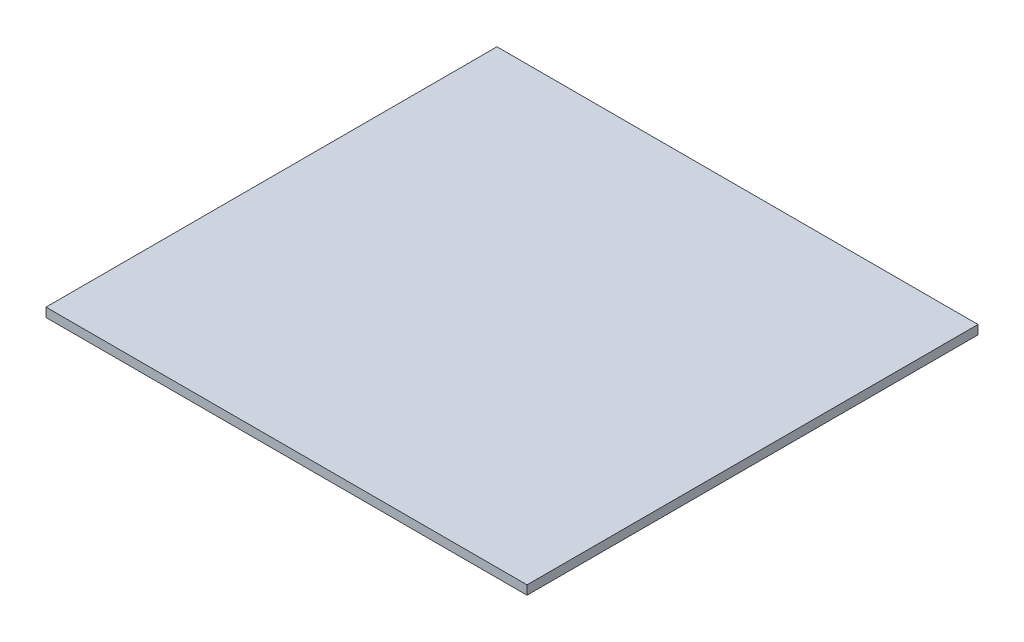
ISO-10303-21;
HEADER;
FILE_DESCRIPTION(('STEP AP214'),'2;1');
FILE_NAME('part.step','',(''),(''),'','','');
FILE_SCHEMA(('AUTOMOTIVE_DESIGN { 1 0 10303 214 1 1 1 1 }'));
ENDSEC;
DATA;
#1=APPLICATION_CONTEXT('core data for automotive mechanical design processes');
#2=APPLICATION_PROTOCOL_DEFINITION('international standard','automotive_design',2000,#1);
#3=PRODUCT_CONTEXT('',#1,'mechanical');
#4=PRODUCT('Part','Part','',(#3));
#5=PRODUCT_RELATED_PRODUCT_CATEGORY('part','',(#4));
#6=PRODUCT_DEFINITION_FORMATION('','',#4);
#7=PRODUCT_DEFINITION_CONTEXT('part definition',#1,'design');
#8=PRODUCT_DEFINITION('design','',#6,#7);
#9=PRODUCT_DEFINITION_SHAPE('','',#8);
#10=(LENGTH_UNIT() NAMED_UNIT(*) SI_UNIT(.MILLI.,.METRE.));
#11=(NAMED_UNIT(*) PLANE_ANGLE_UNIT() SI_UNIT($,.RADIAN.));
#12=(NAMED_UNIT(*) SI_UNIT($,.STERADIAN.) SOLID_ANGLE_UNIT());
#13=UNCERTAINTY_MEASURE_WITH_UNIT(LENGTH_MEASURE(1.E-05),#10,'distance_accuracy_value','');
#14=(GEOMETRIC_REPRESENTATION_CONTEXT(3) GLOBAL_UNCERTAINTY_ASSIGNED_CONTEXT((#13)) GLOBAL_UNIT_ASSIGNED_CONTEXT((#10,
#11,#12)) REPRESENTATION_CONTEXT('',''));
#15=CARTESIAN_POINT('',(0.,0.,0.));
#16=DIRECTION('',(0.,0.,1.));
#17=DIRECTION('',(1.,0.,0.));
#18=AXIS2_PLACEMENT_3D('',#15,#16,#17);
#19=CARTESIAN_POINT('',(0.,3.,-94.006856965687));
#20=DIRECTION('',(1.,0.,0.));
#21=DIRECTION('',(0.,0.,-1.));
#22=AXIS2_PLACEMENT_3D('',#19,#20,#21);
#23=PLANE('',#22);
#24=DIRECTION('',(0.,0.,1.));
#25=VECTOR('',#24,1.);
#26=CARTESIAN_POINT('',(0.,0.,-94.006856965687));
#27=LINE('',#26,#25);
#28=CARTESIAN_POINT('',(0.,0.,-94.006856965687));
#29=VERTEX_POINT('',#28);
#30=CARTESIAN_POINT('',(0.,0.,55.993143034313));
#31=VERTEX_POINT('',#30);
#32=EDGE_CURVE('E94',#29,#31,#27,.T.);
#33=ORIENTED_EDGE('',*,*,#32,.T.);
#34=DIRECTION('',(0.,-1.,0.));
#35=VECTOR('',#34,1.);
#36=CARTESIAN_POINT('',(0.,3.,55.993143034313));
#37=LINE('',#36,#35);
#38=CARTESIAN_POINT('',(0.,3.,55.993143034313));
#39=VERTEX_POINT('',#38);
#40=EDGE_CURVE('E11',#39,#31,#37,.T.);
#41=ORIENTED_EDGE('',*,*,#40,.F.);
#42=DIRECTION('',(0.,0.,1.));
#43=VECTOR('',#42,1.);
#44=CARTESIAN_POINT('',(0.,3.,-94.006856965687));
#45=LINE('',#44,#43);
#46=CARTESIAN_POINT('',(0.,3.,-94.006856965687));
#47=VERTEX_POINT('',#46);
#48=EDGE_CURVE('E82',#47,#39,#45,.T.);
#49=ORIENTED_EDGE('',*,*,#48,.F.);
#50=DIRECTION('',(0.,-1.,0.));
#51=VECTOR('',#50,1.);
#52=CARTESIAN_POINT('',(0.,3.,-94.006856965687));
#53=LINE('',#52,#51);
#54=EDGE_CURVE('E90',#47,#29,#53,.T.);
#55=ORIENTED_EDGE('',*,*,#54,.T.);
#56=EDGE_LOOP('',(#33,#41,#49,#55));
#57=FACE_BOUND('',#56,.T.);
#58=ADVANCED_FACE('F31',(#57),#23,.F.);
#59=CARTESIAN_POINT('',(0.,3.,55.993143034313));
#60=DIRECTION('',(0.,0.,-1.));
#61=DIRECTION('',(-1.,0.,0.));
#62=AXIS2_PLACEMENT_3D('',#59,#60,#61);
#63=PLANE('',#62);
#64=DIRECTION('',(1.,0.,0.));
#65=VECTOR('',#64,1.);
#66=CARTESIAN_POINT('',(0.,0.,55.993143034313));
#67=LINE('',#66,#65);
#68=CARTESIAN_POINT('',(160.,0.,55.993143034313));
#69=VERTEX_POINT('',#68);
#70=EDGE_CURVE('E86',#31,#69,#67,.T.);
#71=ORIENTED_EDGE('',*,*,#70,.T.);
#72=DIRECTION('',(0.,-1.,0.));
#73=VECTOR('',#72,1.);
#74=CARTESIAN_POINT('',(160.,3.,55.993143034313));
#75=LINE('',#74,#73);
#76=CARTESIAN_POINT('',(160.,3.,55.993143034313));
#77=VERTEX_POINT('',#76);
#78=EDGE_CURVE('E39',#77,#69,#75,.T.);
#79=ORIENTED_EDGE('',*,*,#78,.F.);
#80=DIRECTION('',(1.,0.,0.));
#81=VECTOR('',#80,1.);
#82=CARTESIAN_POINT('',(0.,3.,55.993143034313));
#83=LINE('',#82,#81);
#84=EDGE_CURVE('E77',#39,#77,#83,.T.);
#85=ORIENTED_EDGE('',*,*,#84,.F.);
#86=ORIENTED_EDGE('',*,*,#40,.T.);
#87=EDGE_LOOP('',(#71,#79,#85,#86));
#88=FACE_BOUND('',#87,.T.);
#89=ADVANCED_FACE('F85',(#88),#63,.F.);
#90=CARTESIAN_POINT('',(160.,3.,-94.006856965687));
#91=DIRECTION('',(-1.,0.,0.));
#92=DIRECTION('',(0.,0.,1.));
#93=AXIS2_PLACEMENT_3D('',#90,#91,#92);
#94=PLANE('',#93);
#95=DIRECTION('',(0.,0.,-1.));
#96=VECTOR('',#95,1.);
#97=CARTESIAN_POINT('',(160.,0.,-94.006856965687));
#98=LINE('',#97,#96);
#99=CARTESIAN_POINT('',(160.,0.,-94.006856965687));
#100=VERTEX_POINT('',#99);
#101=EDGE_CURVE('E64',#69,#100,#98,.T.);
#102=ORIENTED_EDGE('',*,*,#101,.T.);
#103=DIRECTION('',(0.,-1.,0.));
#104=VECTOR('',#103,1.);
#105=CARTESIAN_POINT('',(160.,3.,-94.006856965687));
#106=LINE('',#105,#104);
#107=CARTESIAN_POINT('',(160.,3.,-94.006856965687));
#108=VERTEX_POINT('',#107);
#109=EDGE_CURVE('E87',#108,#100,#106,.T.);
#110=ORIENTED_EDGE('',*,*,#109,.F.);
#111=DIRECTION('',(0.,0.,-1.));
#112=VECTOR('',#111,1.);
#113=CARTESIAN_POINT('',(160.,3.,-94.006856965687));
#114=LINE('',#113,#112);
#115=EDGE_CURVE('E80',#77,#108,#114,.T.);
#116=ORIENTED_EDGE('',*,*,#115,.F.);
#117=ORIENTED_EDGE('',*,*,#78,.T.);
#118=EDGE_LOOP('',(#102,#110,#116,#117));
#119=FACE_BOUND('',#118,.T.);
#120=ADVANCED_FACE('F88',(#119),#94,.F.);
#121=CARTESIAN_POINT('',(0.,3.,-94.006856965687));
#122=DIRECTION('',(0.,0.,1.));
#123=DIRECTION('',(1.,0.,0.));
#124=AXIS2_PLACEMENT_3D('',#121,#122,#123);
#125=PLANE('',#124);
#126=DIRECTION('',(-1.,0.,0.));
#127=VECTOR('',#126,1.);
#128=CARTESIAN_POINT('',(0.,0.,-94.006856965687));
#129=LINE('',#128,#127);
#130=EDGE_CURVE('E70',#100,#29,#129,.T.);
#131=ORIENTED_EDGE('',*,*,#130,.T.);
#132=ORIENTED_EDGE('',*,*,#54,.F.);
#133=DIRECTION('',(-1.,0.,0.));
#134=VECTOR('',#133,1.);
#135=CARTESIAN_POINT('',(0.,3.,-94.006856965687));
#136=LINE('',#135,#134);
#137=EDGE_CURVE('E47',#108,#47,#136,.T.);
#138=ORIENTED_EDGE('',*,*,#137,.F.);
#139=ORIENTED_EDGE('',*,*,#109,.T.);
#140=EDGE_LOOP('',(#131,#132,#138,#139));
#141=FACE_BOUND('',#140,.T.);
#142=ADVANCED_FACE('F101',(#141),#125,.F.);
#143=CARTESIAN_POINT('',(0.,3.,55.993143034313));
#144=DIRECTION('',(0.,1.,0.));
#145=DIRECTION('',(0.,0.,1.));
#146=AXIS2_PLACEMENT_3D('',#143,#144,#145);
#147=PLANE('',#146);
#148=ORIENTED_EDGE('',*,*,#48,.T.);
#149=ORIENTED_EDGE('',*,*,#84,.T.);
#150=ORIENTED_EDGE('',*,*,#115,.T.);
#151=ORIENTED_EDGE('',*,*,#137,.T.);
#152=EDGE_LOOP('',(#148,#149,#150,#151));
#153=FACE_BOUND('',#152,.T.);
#154=ADVANCED_FACE('F78',(#153),#147,.T.);
#155=CARTESIAN_POINT('',(0.,0.,55.993143034313));
#156=DIRECTION('',(0.,1.,0.));
#157=DIRECTION('',(0.,0.,1.));
#158=AXIS2_PLACEMENT_3D('',#155,#156,#157);
#159=PLANE('',#158);
#160=ORIENTED_EDGE('',*,*,#32,.F.);
#161=ORIENTED_EDGE('',*,*,#130,.F.);
#162=ORIENTED_EDGE('',*,*,#101,.F.);
#163=ORIENTED_EDGE('',*,*,#70,.F.);
#164=EDGE_LOOP('',(#160,#161,#162,#163));
#165=FACE_BOUND('',#164,.T.);
#166=ADVANCED_FACE('F104',(#165),#159,.F.);
#167=CLOSED_SHELL('',(#58,#89,#120,#142,#154,#166));
#168=MANIFOLD_SOLID_BREP('B2',#167);
#169=ADVANCED_BREP_SHAPE_REPRESENTATION('',(#18,#168),#14);
#170=SHAPE_DEFINITION_REPRESENTATION(#9,#169);
ENDSEC;
END-ISO-10303-21;
